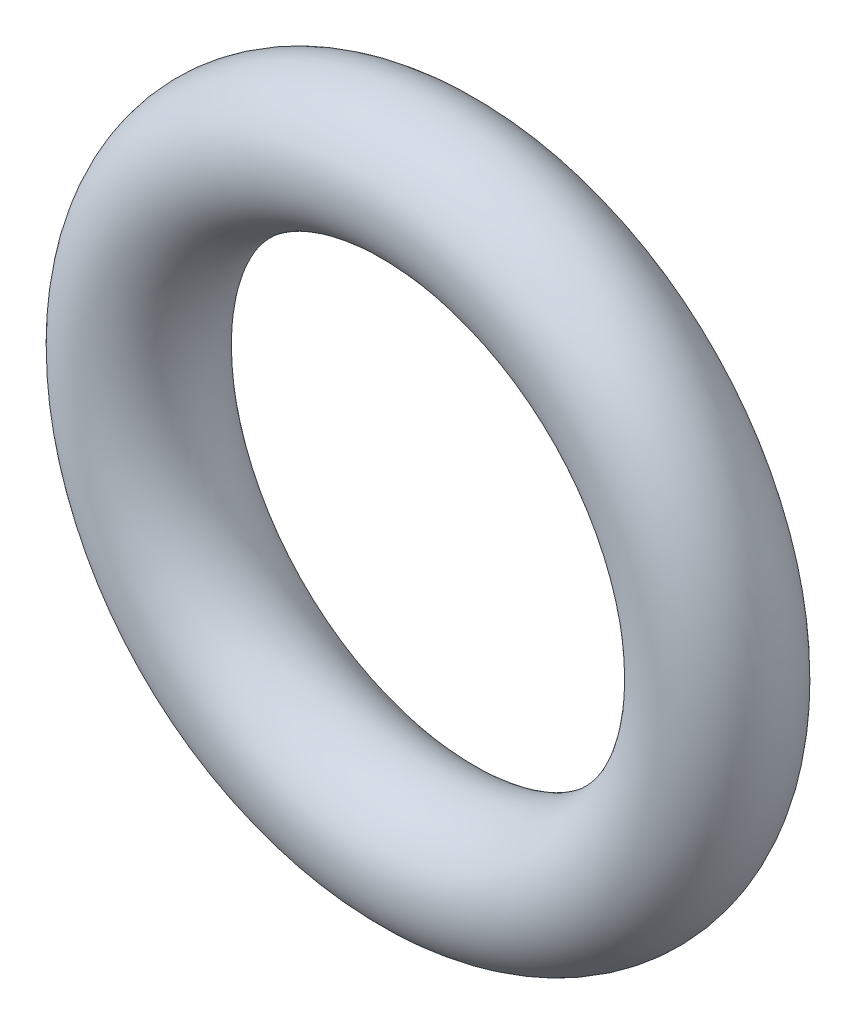
ISO-10303-21;
HEADER;
FILE_DESCRIPTION(('STEP AP214'),'2;1');
FILE_NAME('part.step','',(''),(''),'','','');
FILE_SCHEMA(('AUTOMOTIVE_DESIGN { 1 0 10303 214 1 1 1 1 }'));
ENDSEC;
DATA;
#1=APPLICATION_CONTEXT('core data for automotive mechanical design processes');
#2=APPLICATION_PROTOCOL_DEFINITION('international standard','automotive_design',2000,#1);
#3=PRODUCT_CONTEXT('',#1,'mechanical');
#4=PRODUCT('Part','Part','',(#3));
#5=PRODUCT_RELATED_PRODUCT_CATEGORY('part','',(#4));
#6=PRODUCT_DEFINITION_FORMATION('','',#4);
#7=PRODUCT_DEFINITION_CONTEXT('part definition',#1,'design');
#8=PRODUCT_DEFINITION('design','',#6,#7);
#9=PRODUCT_DEFINITION_SHAPE('','',#8);
#10=(LENGTH_UNIT() NAMED_UNIT(*) SI_UNIT(.MILLI.,.METRE.));
#11=(NAMED_UNIT(*) PLANE_ANGLE_UNIT() SI_UNIT($,.RADIAN.));
#12=(NAMED_UNIT(*) SI_UNIT($,.STERADIAN.) SOLID_ANGLE_UNIT());
#13=UNCERTAINTY_MEASURE_WITH_UNIT(LENGTH_MEASURE(1.E-05),#10,'distance_accuracy_value','');
#14=(GEOMETRIC_REPRESENTATION_CONTEXT(3) GLOBAL_UNCERTAINTY_ASSIGNED_CONTEXT((#13)) GLOBAL_UNIT_ASSIGNED_CONTEXT((#10,
#11,#12)) REPRESENTATION_CONTEXT('',''));
#15=CARTESIAN_POINT('',(0.,0.,0.));
#16=DIRECTION('',(0.,0.,1.));
#17=DIRECTION('',(1.,0.,0.));
#18=AXIS2_PLACEMENT_3D('',#15,#16,#17);
#19=CARTESIAN_POINT('',(0.,0.,0.));
#20=DIRECTION('',(0.,0.,1.));
#21=DIRECTION('',(1.,0.,0.));
#22=AXIS2_PLACEMENT_3D('',#19,#20,#21);
#23=TOROIDAL_SURFACE('',#22,3.9243,0.888999999999998);
#24=CARTESIAN_POINT('',(4.8133,0.,0.));
#25=VERTEX_POINT('',#24);
#26=VERTEX_LOOP('',#25);
#27=FACE_BOUND('',#26,.T.);
#28=ADVANCED_FACE('F30',(#27),#23,.T.);
#29=CLOSED_SHELL('',(#28));
#30=MANIFOLD_SOLID_BREP('B2',#29);
#31=ADVANCED_BREP_SHAPE_REPRESENTATION('',(#18,#30),#14);
#32=SHAPE_DEFINITION_REPRESENTATION(#9,#31);
ENDSEC;
END-ISO-10303-21;
